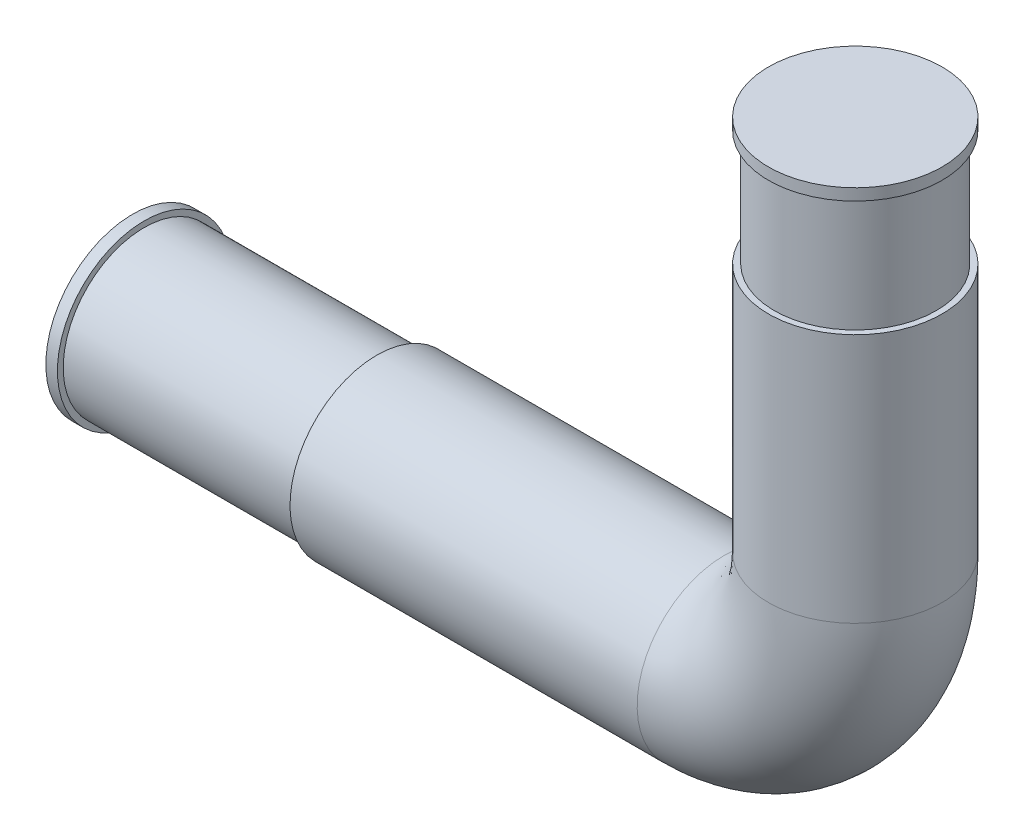
ISO-10303-21;
HEADER;
FILE_DESCRIPTION(('STEP AP214'),'2;1');
FILE_NAME('part.step','',(''),(''),'','','');
FILE_SCHEMA(('AUTOMOTIVE_DESIGN { 1 0 10303 214 1 1 1 1 }'));
ENDSEC;
DATA;
#1=APPLICATION_CONTEXT('core data for automotive mechanical design processes');
#2=APPLICATION_PROTOCOL_DEFINITION('international standard','automotive_design',2000,#1);
#3=PRODUCT_CONTEXT('',#1,'mechanical');
#4=PRODUCT('Part','Part','',(#3));
#5=PRODUCT_RELATED_PRODUCT_CATEGORY('part','',(#4));
#6=PRODUCT_DEFINITION_FORMATION('','',#4);
#7=PRODUCT_DEFINITION_CONTEXT('part definition',#1,'design');
#8=PRODUCT_DEFINITION('design','',#6,#7);
#9=PRODUCT_DEFINITION_SHAPE('','',#8);
#10=(LENGTH_UNIT() NAMED_UNIT(*) SI_UNIT(.MILLI.,.METRE.));
#11=(NAMED_UNIT(*) PLANE_ANGLE_UNIT() SI_UNIT($,.RADIAN.));
#12=(NAMED_UNIT(*) SI_UNIT($,.STERADIAN.) SOLID_ANGLE_UNIT());
#13=UNCERTAINTY_MEASURE_WITH_UNIT(LENGTH_MEASURE(1.E-05),#10,'distance_accuracy_value','');
#14=(GEOMETRIC_REPRESENTATION_CONTEXT(3) GLOBAL_UNCERTAINTY_ASSIGNED_CONTEXT((#13)) GLOBAL_UNIT_ASSIGNED_CONTEXT((#10,
#11,#12)) REPRESENTATION_CONTEXT('',''));
#15=CARTESIAN_POINT('',(0.,0.,0.));
#16=DIRECTION('',(0.,0.,1.));
#17=DIRECTION('',(1.,0.,0.));
#18=AXIS2_PLACEMENT_3D('',#15,#16,#17);
#19=CARTESIAN_POINT('',(-105.022980965729,-67.818,0.));
#20=DIRECTION('',(1.,0.,0.));
#21=DIRECTION('',(0.,1.,0.));
#22=AXIS2_PLACEMENT_3D('',#19,#20,#21);
#23=PLANE('',#22);
#24=CARTESIAN_POINT('',(-105.022980965729,-67.818,0.));
#25=DIRECTION('',(1.,0.,0.));
#26=DIRECTION('',(0.,0.,-1.));
#27=AXIS2_PLACEMENT_3D('',#24,#25,#26);
#28=CIRCLE('',#27,17.78);
#29=CARTESIAN_POINT('',(-105.022980965729,-67.818,-17.78));
#30=VERTEX_POINT('',#29);
#31=EDGE_CURVE('E71',#30,#30,#28,.T.);
#32=ORIENTED_EDGE('',*,*,#31,.T.);
#33=EDGE_LOOP('',(#32));
#34=FACE_BOUND('',#33,.T.);
#35=CARTESIAN_POINT('',(-105.022980965729,-67.818,0.));
#36=DIRECTION('',(1.,0.,0.));
#37=DIRECTION('',(0.,1.,0.));
#38=AXIS2_PLACEMENT_3D('',#35,#36,#37);
#39=CIRCLE('',#38,19.05);
#40=CARTESIAN_POINT('',(-105.022980965729,-48.768,0.));
#41=VERTEX_POINT('',#40);
#42=EDGE_CURVE('E65',#41,#41,#39,.T.);
#43=ORIENTED_EDGE('',*,*,#42,.F.);
#44=EDGE_LOOP('',(#43));
#45=FACE_BOUND('',#44,.T.);
#46=ADVANCED_FACE('F48',(#34,#45),#23,.F.);
#47=CARTESIAN_POINT('',(0.,21.082,0.));
#48=DIRECTION('',(0.,1.,0.));
#49=DIRECTION('',(-1.,0.,0.));
#50=AXIS2_PLACEMENT_3D('',#47,#48,#49);
#51=PLANE('',#50);
#52=CARTESIAN_POINT('',(0.,21.082,0.));
#53=DIRECTION('',(0.,-1.,0.));
#54=DIRECTION('',(1.,0.,0.));
#55=AXIS2_PLACEMENT_3D('',#52,#53,#54);
#56=CIRCLE('',#55,17.78);
#57=CARTESIAN_POINT('',(17.78,21.082,0.));
#58=VERTEX_POINT('',#57);
#59=EDGE_CURVE('E87',#58,#58,#56,.T.);
#60=ORIENTED_EDGE('',*,*,#59,.T.);
#61=EDGE_LOOP('',(#60));
#62=FACE_BOUND('',#61,.T.);
#63=CARTESIAN_POINT('',(0.,21.082,0.));
#64=DIRECTION('',(0.,1.,0.));
#65=DIRECTION('',(-1.,0.,0.));
#66=AXIS2_PLACEMENT_3D('',#63,#64,#65);
#67=CIRCLE('',#66,19.05);
#68=CARTESIAN_POINT('',(-19.05,21.082,0.));
#69=VERTEX_POINT('',#68);
#70=EDGE_CURVE('E11',#69,#69,#67,.T.);
#71=ORIENTED_EDGE('',*,*,#70,.T.);
#72=EDGE_LOOP('',(#71));
#73=FACE_BOUND('',#72,.T.);
#74=ADVANCED_FACE('F135',(#62,#73),#51,.T.);
#75=CARTESIAN_POINT('',(-105.022980965729,-67.818,0.));
#76=DIRECTION('',(1.,0.,0.));
#77=DIRECTION('',(0.,1.,0.));
#78=AXIS2_PLACEMENT_3D('',#75,#76,#77);
#79=CYLINDRICAL_SURFACE('',#78,19.05);
#80=CARTESIAN_POINT('',(-28.822980965729,-67.818,0.));
#81=DIRECTION('',(1.,0.,0.));
#82=DIRECTION('',(0.,1.,0.));
#83=AXIS2_PLACEMENT_3D('',#80,#81,#82);
#84=CIRCLE('',#83,19.05);
#85=CARTESIAN_POINT('',(-28.822980965729,-48.768,0.));
#86=VERTEX_POINT('',#85);
#87=EDGE_CURVE('E60',#86,#86,#84,.T.);
#88=ORIENTED_EDGE('',*,*,#87,.F.);
#89=EDGE_LOOP('',(#88));
#90=FACE_BOUND('',#89,.T.);
#91=ORIENTED_EDGE('',*,*,#42,.T.);
#92=EDGE_LOOP('',(#91));
#93=FACE_BOUND('',#92,.T.);
#94=ADVANCED_FACE('F129',(#90,#93),#79,.T.);
#95=CARTESIAN_POINT('',(-28.822980965729,-48.7680000000001,0.));
#96=CARTESIAN_POINT('',(-27.9573253492652,-48.7679999995896,0.));
#97=CARTESIAN_POINT('',(-27.0792583980589,-48.5797967077074,0.));
#98=CARTESIAN_POINT('',(-25.0539769522166,-47.5531577998508,0.));
#99=CARTESIAN_POINT('',(-23.9164122379755,-46.6837476521458,0.));
#100=CARTESIAN_POINT('',(-21.7738564182945,-44.069471669424,0.));
#101=CARTESIAN_POINT('',(-20.7887897680658,-42.3285750339048,0.));
#102=CARTESIAN_POINT('',(-19.7657170672342,-39.3120223095731,0.));
#103=CARTESIAN_POINT('',(-19.4989095075182,-38.2425040605558,0.));
#104=CARTESIAN_POINT('',(-19.2304894584558,-36.5912241494911,0.));
#105=CARTESIAN_POINT('',(-19.1628286990451,-36.0330665614934,0.));
#106=CARTESIAN_POINT('',(-19.0951454265132,-35.1909155938161,0.));
#107=CARTESIAN_POINT('',(-19.078208299273,-34.9093813608813,0.));
#108=CARTESIAN_POINT('',(-19.0612787895918,-34.4866942377461,0.));
#109=CARTESIAN_POINT('',(-19.057047652615,-34.3457342040856,0.));
#110=CARTESIAN_POINT('',(-19.0528181075592,-34.1343020437702,0.));
#111=CARTESIAN_POINT('',(-19.0517610784959,-34.0638259656063,0.));
#112=CARTESIAN_POINT('',(-19.0507042881956,-33.9581267906528,0.));
#113=CARTESIAN_POINT('',(-19.0504401477962,-33.9228962221446,0.));
#114=CARTESIAN_POINT('',(-19.0500880036988,-33.8524422212091,0.));
#115=CARTESIAN_POINT('',(-19.05,-33.8330858372801,0.));
#116=CARTESIAN_POINT('',(-19.05,-33.782,0.));
#117=CARTESIAN_POINT('',(-28.822980965729,-48.7680000000001,38.1));
#118=CARTESIAN_POINT('',(-27.9573253492652,-48.7679999995896,38.1));
#119=CARTESIAN_POINT('',(-27.0792583980589,-48.5797967077074,38.1));
#120=CARTESIAN_POINT('',(-25.0539769522166,-47.5531577998508,38.1));
#121=CARTESIAN_POINT('',(-23.9164122379755,-46.6837476521458,38.1));
#122=CARTESIAN_POINT('',(-21.7738564182946,-44.069471669424,38.1));
#123=CARTESIAN_POINT('',(-20.7887897680658,-42.3285750339048,38.1));
#124=CARTESIAN_POINT('',(-19.7657170672342,-39.3120223095731,38.1));
#125=CARTESIAN_POINT('',(-19.4989095075182,-38.2425040605558,38.1));
#126=CARTESIAN_POINT('',(-19.2304894584558,-36.5912241494911,38.1));
#127=CARTESIAN_POINT('',(-19.1628286990451,-36.0330665614934,38.1));
#128=CARTESIAN_POINT('',(-19.0951454265132,-35.1909155938162,38.1));
#129=CARTESIAN_POINT('',(-19.078208299273,-34.9093813608813,38.1));
#130=CARTESIAN_POINT('',(-19.0612787895918,-34.4866942377461,38.1));
#131=CARTESIAN_POINT('',(-19.057047652615,-34.3457342040856,38.1));
#132=CARTESIAN_POINT('',(-19.0528181075592,-34.1343020437703,38.1));
#133=CARTESIAN_POINT('',(-19.0517610784959,-34.0638259656063,38.1));
#134=CARTESIAN_POINT('',(-19.0507042881956,-33.9581267906528,38.1));
#135=CARTESIAN_POINT('',(-19.0504401477962,-33.9228962221446,38.1));
#136=CARTESIAN_POINT('',(-19.0500880036988,-33.8524422212091,38.1));
#137=CARTESIAN_POINT('',(-19.05,-33.8330858372801,38.1));
#138=CARTESIAN_POINT('',(-19.05,-33.782,38.1));
#139=CARTESIAN_POINT('',(-28.822980965729,-86.8680000000001,38.1));
#140=CARTESIAN_POINT('',(-21.8022246027918,-86.8679999989056,38.1));
#141=CARTESIAN_POINT('',(-14.9029657570143,-85.1230033050878,38.1));
#142=CARTESIAN_POINT('',(-2.77729969087174,-78.9763610304513,38.1));
#143=CARTESIAN_POINT('',(2.4553963902149,-74.6121250416577,38.1));
#144=CARTESIAN_POINT('',(10.7900554685665,-64.4424487885772,38.1));
#145=CARTESIAN_POINT('',(13.9108981181488,-58.6395189121592,38.1));
#146=CARTESIAN_POINT('',(17.0064578822958,-49.5121917644429,38.1));
#147=CARTESIAN_POINT('',(17.7755119640558,-46.397778851796,38.1));
#148=CARTESIAN_POINT('',(18.5418926434435,-41.6831197783193,38.1));
#149=CARTESIAN_POINT('',(18.7328107187803,-40.1044037306059,38.1));
#150=CARTESIAN_POINT('',(18.9233508680132,-37.7336027180614,38.1));
#151=CARTESIAN_POINT('',(18.9708930335985,-36.9428794815637,38.1));
#152=CARTESIAN_POINT('',(19.0183864276906,-35.7570893149066,38.1));
#153=CARTESIAN_POINT('',(19.0302476885179,-35.3618748389639,38.1));
#154=CARTESIAN_POINT('',(19.042102776765,-34.7692468172473,38.1));
#155=CARTESIAN_POINT('',(19.0450650114214,-34.5717364096843,38.1));
#156=CARTESIAN_POINT('',(19.048026470091,-34.2755340903136,38.1));
#157=CARTESIAN_POINT('',(19.0487666410727,-34.1768105314068,38.1));
#158=CARTESIAN_POINT('',(19.0497534060287,-33.979386977707,38.1));
#159=CARTESIAN_POINT('',(19.05,-33.8648199343425,38.1));
#160=CARTESIAN_POINT('',(19.05,-33.782,38.1));
#161=CARTESIAN_POINT('',(-28.822980965729,-86.8680000000001,0.));
#162=CARTESIAN_POINT('',(-21.8022246027918,-86.8679999989056,0.));
#163=CARTESIAN_POINT('',(-14.9029657570143,-85.1230033050878,0.));
#164=CARTESIAN_POINT('',(-2.77729969087174,-78.9763610304513,0.));
#165=CARTESIAN_POINT('',(2.4553963902149,-74.6121250416577,0.));
#166=CARTESIAN_POINT('',(10.7900554685665,-64.4424487885772,0.));
#167=CARTESIAN_POINT('',(13.9108981181488,-58.6395189121592,0.));
#168=CARTESIAN_POINT('',(17.0064578822958,-49.5121917644429,0.));
#169=CARTESIAN_POINT('',(17.7755119640558,-46.397778851796,0.));
#170=CARTESIAN_POINT('',(18.5418926434435,-41.6831197783193,0.));
#171=CARTESIAN_POINT('',(18.7328107187803,-40.1044037306059,0.));
#172=CARTESIAN_POINT('',(18.9233508680132,-37.7336027180614,0.));
#173=CARTESIAN_POINT('',(18.9708930335985,-36.9428794815637,0.));
#174=CARTESIAN_POINT('',(19.0183864276906,-35.7570893149066,0.));
#175=CARTESIAN_POINT('',(19.0302476885179,-35.3618748389639,0.));
#176=CARTESIAN_POINT('',(19.042102776765,-34.7692468172473,0.));
#177=CARTESIAN_POINT('',(19.0450650114214,-34.5717364096843,0.));
#178=CARTESIAN_POINT('',(19.048026470091,-34.2755340903136,0.));
#179=CARTESIAN_POINT('',(19.0487666410727,-34.1768105314068,0.));
#180=CARTESIAN_POINT('',(19.0497534060287,-33.979386977707,0.));
#181=CARTESIAN_POINT('',(19.05,-33.8648199343425,0.));
#182=CARTESIAN_POINT('',(19.05,-33.782,0.));
#183=CARTESIAN_POINT('',(-28.822980965729,-86.8680000000001,-38.1));
#184=CARTESIAN_POINT('',(-21.8022246027918,-86.8679999989056,-38.1));
#185=CARTESIAN_POINT('',(-14.9029657570143,-85.1230033050878,-38.1));
#186=CARTESIAN_POINT('',(-2.77729969087174,-78.9763610304513,-38.1));
#187=CARTESIAN_POINT('',(2.4553963902149,-74.6121250416577,-38.1));
#188=CARTESIAN_POINT('',(10.7900554685665,-64.4424487885772,-38.1));
#189=CARTESIAN_POINT('',(13.9108981181488,-58.6395189121592,-38.1));
#190=CARTESIAN_POINT('',(17.0064578822958,-49.5121917644429,-38.1));
#191=CARTESIAN_POINT('',(17.7755119640558,-46.397778851796,-38.1));
#192=CARTESIAN_POINT('',(18.5418926434435,-41.6831197783193,-38.1));
#193=CARTESIAN_POINT('',(18.7328107187803,-40.1044037306059,-38.1));
#194=CARTESIAN_POINT('',(18.9233508680132,-37.7336027180614,-38.1));
#195=CARTESIAN_POINT('',(18.9708930335985,-36.9428794815637,-38.1));
#196=CARTESIAN_POINT('',(19.0183864276906,-35.7570893149066,-38.1));
#197=CARTESIAN_POINT('',(19.0302476885179,-35.3618748389639,-38.1));
#198=CARTESIAN_POINT('',(19.042102776765,-34.7692468172473,-38.1));
#199=CARTESIAN_POINT('',(19.0450650114214,-34.5717364096843,-38.1));
#200=CARTESIAN_POINT('',(19.048026470091,-34.2755340903136,-38.1));
#201=CARTESIAN_POINT('',(19.0487666410727,-34.1768105314068,-38.1));
#202=CARTESIAN_POINT('',(19.0497534060287,-33.979386977707,-38.1));
#203=CARTESIAN_POINT('',(19.05,-33.8648199343425,-38.1));
#204=CARTESIAN_POINT('',(19.05,-33.782,-38.1));
#205=CARTESIAN_POINT('',(-28.822980965729,-48.7680000000001,-38.1));
#206=CARTESIAN_POINT('',(-27.9573253492652,-48.7679999995896,-38.1));
#207=CARTESIAN_POINT('',(-27.0792583980589,-48.5797967077074,-38.1));
#208=CARTESIAN_POINT('',(-25.0539769522166,-47.5531577998508,-38.1));
#209=CARTESIAN_POINT('',(-23.9164122379755,-46.6837476521458,-38.1));
#210=CARTESIAN_POINT('',(-21.7738564182946,-44.069471669424,-38.1));
#211=CARTESIAN_POINT('',(-20.7887897680658,-42.3285750339048,-38.1));
#212=CARTESIAN_POINT('',(-19.7657170672342,-39.3120223095731,-38.1));
#213=CARTESIAN_POINT('',(-19.4989095075182,-38.2425040605558,-38.1));
#214=CARTESIAN_POINT('',(-19.2304894584558,-36.5912241494911,-38.1));
#215=CARTESIAN_POINT('',(-19.1628286990451,-36.0330665614934,-38.1));
#216=CARTESIAN_POINT('',(-19.0951454265132,-35.1909155938162,-38.1));
#217=CARTESIAN_POINT('',(-19.078208299273,-34.9093813608813,-38.1));
#218=CARTESIAN_POINT('',(-19.0612787895918,-34.4866942377461,-38.1));
#219=CARTESIAN_POINT('',(-19.057047652615,-34.3457342040856,-38.1));
#220=CARTESIAN_POINT('',(-19.0528181075592,-34.1343020437703,-38.1));
#221=CARTESIAN_POINT('',(-19.0517610784959,-34.0638259656063,-38.1));
#222=CARTESIAN_POINT('',(-19.0507042881956,-33.9581267906528,-38.1));
#223=CARTESIAN_POINT('',(-19.0504401477962,-33.9228962221446,-38.1));
#224=CARTESIAN_POINT('',(-19.0500880036988,-33.8524422212091,-38.1));
#225=CARTESIAN_POINT('',(-19.05,-33.8330858372801,-38.1));
#226=CARTESIAN_POINT('',(-19.05,-33.782,-38.1));
#227=CARTESIAN_POINT('',(-28.822980965729,-48.7680000000001,0.));
#228=CARTESIAN_POINT('',(-27.9573253492652,-48.7679999995896,0.));
#229=CARTESIAN_POINT('',(-27.0792583980589,-48.5797967077074,0.));
#230=CARTESIAN_POINT('',(-25.0539769522166,-47.5531577998508,0.));
#231=CARTESIAN_POINT('',(-23.9164122379755,-46.6837476521458,0.));
#232=CARTESIAN_POINT('',(-21.7738564182945,-44.069471669424,0.));
#233=CARTESIAN_POINT('',(-20.7887897680658,-42.3285750339048,0.));
#234=CARTESIAN_POINT('',(-19.7657170672342,-39.3120223095731,0.));
#235=CARTESIAN_POINT('',(-19.4989095075182,-38.2425040605558,0.));
#236=CARTESIAN_POINT('',(-19.2304894584558,-36.5912241494911,0.));
#237=CARTESIAN_POINT('',(-19.1628286990451,-36.0330665614934,0.));
#238=CARTESIAN_POINT('',(-19.0951454265132,-35.1909155938161,0.));
#239=CARTESIAN_POINT('',(-19.078208299273,-34.9093813608813,0.));
#240=CARTESIAN_POINT('',(-19.0612787895918,-34.4866942377461,0.));
#241=CARTESIAN_POINT('',(-19.057047652615,-34.3457342040856,0.));
#242=CARTESIAN_POINT('',(-19.0528181075592,-34.1343020437702,0.));
#243=CARTESIAN_POINT('',(-19.0517610784959,-34.0638259656063,0.));
#244=CARTESIAN_POINT('',(-19.0507042881956,-33.9581267906528,0.));
#245=CARTESIAN_POINT('',(-19.0504401477962,-33.9228962221446,0.));
#246=CARTESIAN_POINT('',(-19.0500880036988,-33.8524422212091,0.));
#247=CARTESIAN_POINT('',(-19.05,-33.8330858372801,0.));
#248=CARTESIAN_POINT('',(-19.05,-33.782,0.));
#249=(BOUNDED_SURFACE() B_SPLINE_SURFACE(3,3,((#95,#96,#97,#98,#99,#100,#101,#102,#103,#104,
#105,#106,#107,#108,#109,#110,#111,#112,#113,#114,#115,#116),(#117,#118,#119,#120,#121,#122,
#123,#124,#125,#126,#127,#128,#129,#130,#131,#132,#133,#134,#135,#136,#137,#138),(#139,#140,
#141,#142,#143,#144,#145,#146,#147,#148,#149,#150,#151,#152,#153,#154,#155,#156,#157,#158,#159,
#160),(#161,#162,#163,#164,#165,#166,#167,#168,#169,#170,#171,#172,#173,#174,#175,#176,#177,
#178,#179,#180,#181,#182),(#183,#184,#185,#186,#187,#188,#189,#190,#191,#192,#193,#194,#195,
#196,#197,#198,#199,#200,#201,#202,#203,#204),(#205,#206,#207,#208,#209,#210,#211,#212,#213,
#214,#215,#216,#217,#218,#219,#220,#221,#222,#223,#224,#225,#226),(#227,#228,#229,#230,#231,
#232,#233,#234,#235,#236,#237,#238,#239,#240,#241,#242,#243,#244,#245,#246,#247,#248)),
.UNSPECIFIED.,.T.,.F.,.F.) B_SPLINE_SURFACE_WITH_KNOTS((4,3,4),(4,2,2,2,2,2,2,2,2,2,4),(0.,0.5,
1.),(0.422118243685589,0.490607398900786,0.559096554115982,0.627585709331179,0.661830286938778,
0.678952575742577,0.687513720144477,0.691794292345426,0.693934578445901,0.695004721496139,
0.696074864546376),
.UNSPECIFIED.) GEOMETRIC_REPRESENTATION_ITEM() RATIONAL_B_SPLINE_SURFACE(((1.,1.,1.,1.,1.,1.,1.,
1.,1.,1.,1.,1.,1.,1.,1.,1.,1.,1.,1.,1.,1.,1.),(0.333333333333333,0.333333333333333,
0.333333333333333,0.333333333333333,0.333333333333333,0.333333333333333,0.333333333333333,
0.333333333333333,0.333333333333333,0.333333333333333,0.333333333333333,0.333333333333333,
0.333333333333333,0.333333333333333,0.333333333333333,0.333333333333333,0.333333333333333,
0.333333333333333,0.333333333333333,0.333333333333333,0.333333333333333,0.333333333333333),
(0.333333333333333,0.333333333333333,0.333333333333333,0.333333333333333,0.333333333333333,
0.333333333333333,0.333333333333333,0.333333333333333,0.333333333333333,0.333333333333333,
0.333333333333333,0.333333333333333,0.333333333333333,0.333333333333333,0.333333333333333,
0.333333333333333,0.333333333333333,0.333333333333333,0.333333333333333,0.333333333333333,
0.333333333333333,0.333333333333333),(1.,1.,1.,1.,1.,1.,1.,1.,1.,1.,1.,1.,1.,1.,1.,1.,1.,1.,1.,
1.,1.,1.),(0.333333333333333,0.333333333333333,0.333333333333333,0.333333333333333,
0.333333333333333,0.333333333333333,0.333333333333333,0.333333333333333,0.333333333333333,
0.333333333333333,0.333333333333333,0.333333333333333,0.333333333333333,0.333333333333333,
0.333333333333333,0.333333333333333,0.333333333333333,0.333333333333333,0.333333333333333,
0.333333333333333,0.333333333333333,0.333333333333333),(0.333333333333333,0.333333333333333,
0.333333333333333,0.333333333333333,0.333333333333333,0.333333333333333,0.333333333333333,
0.333333333333333,0.333333333333333,0.333333333333333,0.333333333333333,0.333333333333333,
0.333333333333333,0.333333333333333,0.333333333333333,0.333333333333333,0.333333333333333,
0.333333333333333,0.333333333333333,0.333333333333333,0.333333333333333,0.333333333333333),(1.,
1.,1.,1.,1.,1.,1.,1.,1.,1.,1.,1.,1.,1.,1.,1.,1.,1.,1.,1.,1.,1.))) REPRESENTATION_ITEM('') SURFACE());
#250=CARTESIAN_POINT('',(0.,-33.782,0.));
#251=DIRECTION('',(0.,1.,0.));
#252=DIRECTION('',(-1.,0.,0.));
#253=AXIS2_PLACEMENT_3D('',#250,#251,#252);
#254=CIRCLE('',#253,19.05);
#255=CARTESIAN_POINT('',(-19.05,-33.782,0.));
#256=VERTEX_POINT('',#255);
#257=EDGE_CURVE('E55',#256,#256,#254,.T.);
#258=ORIENTED_EDGE('',*,*,#257,.F.);
#259=EDGE_LOOP('',(#258));
#260=FACE_BOUND('',#259,.T.);
#261=ORIENTED_EDGE('',*,*,#87,.T.);
#262=EDGE_LOOP('',(#261));
#263=FACE_BOUND('',#262,.T.);
#264=ADVANCED_FACE('F119',(#260,#263),#249,.T.);
#265=CARTESIAN_POINT('',(0.,-33.782,0.));
#266=DIRECTION('',(0.,1.,0.));
#267=DIRECTION('',(-1.,0.,0.));
#268=AXIS2_PLACEMENT_3D('',#265,#266,#267);
#269=CYLINDRICAL_SURFACE('',#268,19.05);
#270=ORIENTED_EDGE('',*,*,#70,.F.);
#271=EDGE_LOOP('',(#270));
#272=FACE_BOUND('',#271,.T.);
#273=ORIENTED_EDGE('',*,*,#257,.T.);
#274=EDGE_LOOP('',(#273));
#275=FACE_BOUND('',#274,.T.);
#276=ADVANCED_FACE('F116',(#272,#275),#269,.T.);
#277=CARTESIAN_POINT('',(-105.022980965729,-67.818,0.));
#278=DIRECTION('',(1.,0.,0.));
#279=DIRECTION('',(0.,0.,-1.));
#280=AXIS2_PLACEMENT_3D('',#277,#278,#279);
#281=CYLINDRICAL_SURFACE('',#280,17.78);
#282=CARTESIAN_POINT('',(-156.076980965729,-67.818,0.));
#283=DIRECTION('',(1.,0.,0.));
#284=DIRECTION('',(0.,0.,-1.));
#285=AXIS2_PLACEMENT_3D('',#282,#283,#284);
#286=CIRCLE('',#285,17.78);
#287=CARTESIAN_POINT('',(-156.076980965729,-67.818,-17.78));
#288=VERTEX_POINT('',#287);
#289=EDGE_CURVE('E72',#288,#288,#286,.T.);
#290=ORIENTED_EDGE('',*,*,#289,.T.);
#291=EDGE_LOOP('',(#290));
#292=FACE_BOUND('',#291,.T.);
#293=ORIENTED_EDGE('',*,*,#31,.F.);
#294=EDGE_LOOP('',(#293));
#295=FACE_BOUND('',#294,.T.);
#296=ADVANCED_FACE('F118',(#292,#295),#281,.T.);
#297=CARTESIAN_POINT('',(-156.076980965729,-67.818,0.));
#298=DIRECTION('',(1.,0.,0.));
#299=DIRECTION('',(0.,0.,-1.));
#300=AXIS2_PLACEMENT_3D('',#297,#298,#299);
#301=CYLINDRICAL_SURFACE('',#300,19.05);
#302=CARTESIAN_POINT('',(-158.616980965729,-67.818,0.));
#303=DIRECTION('',(1.,0.,0.));
#304=DIRECTION('',(0.,0.,-1.));
#305=AXIS2_PLACEMENT_3D('',#302,#303,#304);
#306=CIRCLE('',#305,19.05);
#307=CARTESIAN_POINT('',(-158.616980965729,-67.818,-19.05));
#308=VERTEX_POINT('',#307);
#309=EDGE_CURVE('E76',#308,#308,#306,.T.);
#310=ORIENTED_EDGE('',*,*,#309,.T.);
#311=EDGE_LOOP('',(#310));
#312=FACE_BOUND('',#311,.T.);
#313=CARTESIAN_POINT('',(-156.076980965729,-67.818,0.));
#314=DIRECTION('',(1.,0.,0.));
#315=DIRECTION('',(0.,0.,-1.));
#316=AXIS2_PLACEMENT_3D('',#313,#314,#315);
#317=CIRCLE('',#316,19.05);
#318=CARTESIAN_POINT('',(-156.076980965729,-67.818,-19.05));
#319=VERTEX_POINT('',#318);
#320=EDGE_CURVE('E83',#319,#319,#317,.T.);
#321=ORIENTED_EDGE('',*,*,#320,.F.);
#322=EDGE_LOOP('',(#321));
#323=FACE_BOUND('',#322,.T.);
#324=ADVANCED_FACE('F126',(#312,#323),#301,.T.);
#325=CARTESIAN_POINT('',(-158.616980965729,-67.818,0.));
#326=DIRECTION('',(1.,0.,0.));
#327=DIRECTION('',(0.,0.,-1.));
#328=AXIS2_PLACEMENT_3D('',#325,#326,#327);
#329=PLANE('',#328);
#330=ORIENTED_EDGE('',*,*,#309,.F.);
#331=EDGE_LOOP('',(#330));
#332=FACE_BOUND('',#331,.T.);
#333=ADVANCED_FACE('F156',(#332),#329,.F.);
#334=CARTESIAN_POINT('',(-156.076980965729,-48.768,0.));
#335=DIRECTION('',(-1.,0.,0.));
#336=DIRECTION('',(0.,0.,1.));
#337=AXIS2_PLACEMENT_3D('',#334,#335,#336);
#338=PLANE('',#337);
#339=ORIENTED_EDGE('',*,*,#289,.F.);
#340=EDGE_LOOP('',(#339));
#341=FACE_BOUND('',#340,.T.);
#342=ORIENTED_EDGE('',*,*,#320,.T.);
#343=EDGE_LOOP('',(#342));
#344=FACE_BOUND('',#343,.T.);
#345=ADVANCED_FACE('F148',(#341,#344),#338,.F.);
#346=CARTESIAN_POINT('',(0.,21.082,0.));
#347=DIRECTION('',(0.,-1.,0.));
#348=DIRECTION('',(1.,0.,0.));
#349=AXIS2_PLACEMENT_3D('',#346,#347,#348);
#350=CYLINDRICAL_SURFACE('',#349,17.78);
#351=CARTESIAN_POINT('',(0.,46.482,0.));
#352=DIRECTION('',(0.,-1.,0.));
#353=DIRECTION('',(1.,0.,0.));
#354=AXIS2_PLACEMENT_3D('',#351,#352,#353);
#355=CIRCLE('',#354,17.78);
#356=CARTESIAN_POINT('',(17.78,46.482,0.));
#357=VERTEX_POINT('',#356);
#358=EDGE_CURVE('E91',#357,#357,#355,.T.);
#359=ORIENTED_EDGE('',*,*,#358,.T.);
#360=EDGE_LOOP('',(#359));
#361=FACE_BOUND('',#360,.T.);
#362=ORIENTED_EDGE('',*,*,#59,.F.);
#363=EDGE_LOOP('',(#362));
#364=FACE_BOUND('',#363,.T.);
#365=ADVANCED_FACE('F146',(#361,#364),#350,.T.);
#366=CARTESIAN_POINT('',(0.,46.482,0.));
#367=DIRECTION('',(0.,-1.,0.));
#368=DIRECTION('',(0.,0.,-1.));
#369=AXIS2_PLACEMENT_3D('',#366,#367,#368);
#370=CYLINDRICAL_SURFACE('',#369,19.05);
#371=CARTESIAN_POINT('',(0.,49.022,0.));
#372=DIRECTION('',(0.,-1.,0.));
#373=DIRECTION('',(0.,0.,-1.));
#374=AXIS2_PLACEMENT_3D('',#371,#372,#373);
#375=CIRCLE('',#374,19.05);
#376=CARTESIAN_POINT('',(0.,49.022,-19.05));
#377=VERTEX_POINT('',#376);
#378=EDGE_CURVE('E99',#377,#377,#375,.T.);
#379=ORIENTED_EDGE('',*,*,#378,.T.);
#380=EDGE_LOOP('',(#379));
#381=FACE_BOUND('',#380,.T.);
#382=CARTESIAN_POINT('',(0.,46.482,0.));
#383=DIRECTION('',(0.,-1.,0.));
#384=DIRECTION('',(0.,0.,-1.));
#385=AXIS2_PLACEMENT_3D('',#382,#383,#384);
#386=CIRCLE('',#385,19.05);
#387=CARTESIAN_POINT('',(0.,46.482,-19.05));
#388=VERTEX_POINT('',#387);
#389=EDGE_CURVE('E95',#388,#388,#386,.T.);
#390=ORIENTED_EDGE('',*,*,#389,.F.);
#391=EDGE_LOOP('',(#390));
#392=FACE_BOUND('',#391,.T.);
#393=ADVANCED_FACE('F104',(#381,#392),#370,.T.);
#394=CARTESIAN_POINT('',(19.05,46.482,0.));
#395=DIRECTION('',(0.,1.,0.));
#396=DIRECTION('',(0.,0.,1.));
#397=AXIS2_PLACEMENT_3D('',#394,#395,#396);
#398=PLANE('',#397);
#399=ORIENTED_EDGE('',*,*,#358,.F.);
#400=EDGE_LOOP('',(#399));
#401=FACE_BOUND('',#400,.T.);
#402=ORIENTED_EDGE('',*,*,#389,.T.);
#403=EDGE_LOOP('',(#402));
#404=FACE_BOUND('',#403,.T.);
#405=ADVANCED_FACE('F109',(#401,#404),#398,.F.);
#406=CARTESIAN_POINT('',(0.,49.022,0.));
#407=DIRECTION('',(0.,-1.,0.));
#408=DIRECTION('',(0.,0.,-1.));
#409=AXIS2_PLACEMENT_3D('',#406,#407,#408);
#410=PLANE('',#409);
#411=ORIENTED_EDGE('',*,*,#378,.F.);
#412=EDGE_LOOP('',(#411));
#413=FACE_BOUND('',#412,.T.);
#414=ADVANCED_FACE('F107',(#413),#410,.F.);
#415=CLOSED_SHELL('',(#46,#74,#94,#264,#276,#296,#324,#333,#345,#365,#393,#405,#414));
#416=MANIFOLD_SOLID_BREP('B2',#415);
#417=ADVANCED_BREP_SHAPE_REPRESENTATION('',(#18,#416),#14);
#418=SHAPE_DEFINITION_REPRESENTATION(#9,#417);
ENDSEC;
END-ISO-10303-21;
